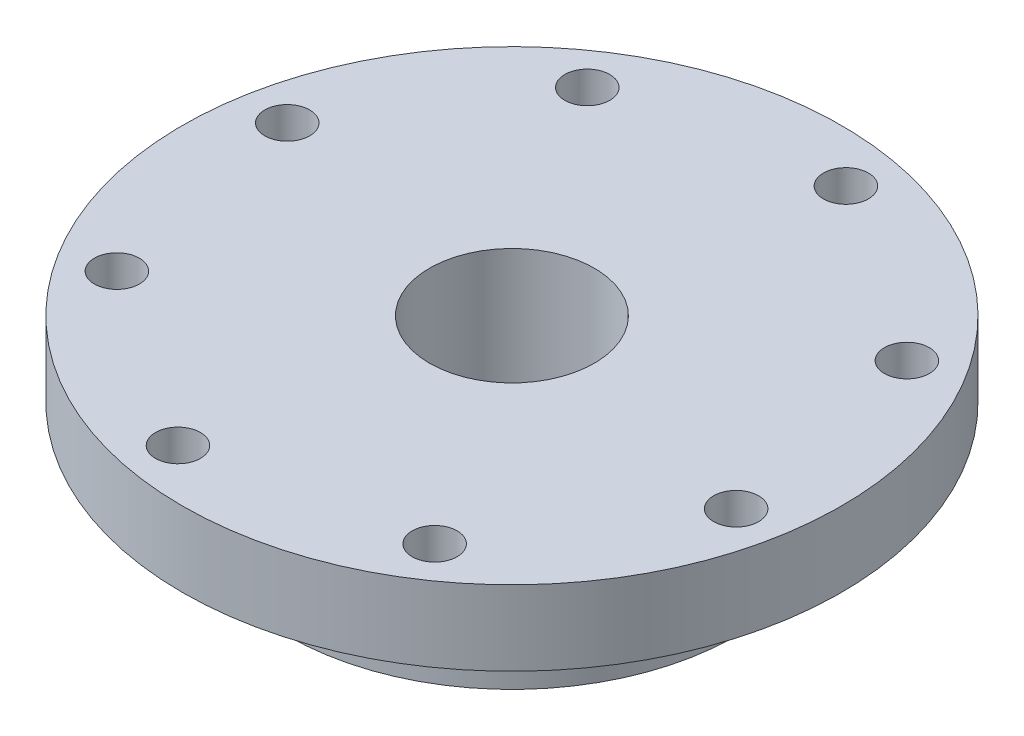
ISO-10303-21;
HEADER;
FILE_DESCRIPTION(('STEP AP214'),'2;1');
FILE_NAME('part.step','',(''),(''),'','','');
FILE_SCHEMA(('AUTOMOTIVE_DESIGN { 1 0 10303 214 1 1 1 1 }'));
ENDSEC;
DATA;
#1=APPLICATION_CONTEXT('core data for automotive mechanical design processes');
#2=APPLICATION_PROTOCOL_DEFINITION('international standard','automotive_design',2000,#1);
#3=PRODUCT_CONTEXT('',#1,'mechanical');
#4=PRODUCT('Part','Part','',(#3));
#5=PRODUCT_RELATED_PRODUCT_CATEGORY('part','',(#4));
#6=PRODUCT_DEFINITION_FORMATION('','',#4);
#7=PRODUCT_DEFINITION_CONTEXT('part definition',#1,'design');
#8=PRODUCT_DEFINITION('design','',#6,#7);
#9=PRODUCT_DEFINITION_SHAPE('','',#8);
#10=(LENGTH_UNIT() NAMED_UNIT(*) SI_UNIT(.MILLI.,.METRE.));
#11=(NAMED_UNIT(*) PLANE_ANGLE_UNIT() SI_UNIT($,.RADIAN.));
#12=(NAMED_UNIT(*) SI_UNIT($,.STERADIAN.) SOLID_ANGLE_UNIT());
#13=UNCERTAINTY_MEASURE_WITH_UNIT(LENGTH_MEASURE(1.E-05),#10,'distance_accuracy_value','');
#14=(GEOMETRIC_REPRESENTATION_CONTEXT(3) GLOBAL_UNCERTAINTY_ASSIGNED_CONTEXT((#13)) GLOBAL_UNIT_ASSIGNED_CONTEXT((#10,
#11,#12)) REPRESENTATION_CONTEXT('',''));
#15=CARTESIAN_POINT('',(0.,0.,0.));
#16=DIRECTION('',(0.,0.,1.));
#17=DIRECTION('',(1.,0.,0.));
#18=AXIS2_PLACEMENT_3D('',#15,#16,#17);
#19=CARTESIAN_POINT('',(0.,41.4701206140351,0.));
#20=DIRECTION('',(0.,1.,0.));
#21=DIRECTION('',(0.,0.,1.));
#22=AXIS2_PLACEMENT_3D('',#19,#20,#21);
#23=CYLINDRICAL_SURFACE('',#22,5.49999999999999);
#24=CARTESIAN_POINT('',(0.,0.,0.));
#25=DIRECTION('',(0.,1.,0.));
#26=DIRECTION('',(0.,0.,1.));
#27=AXIS2_PLACEMENT_3D('',#24,#25,#26);
#28=CIRCLE('',#27,5.49999999999999);
#29=CARTESIAN_POINT('',(0.,0.,5.49999999999999));
#30=VERTEX_POINT('',#29);
#31=EDGE_CURVE('E10',#30,#30,#28,.T.);
#32=ORIENTED_EDGE('',*,*,#31,.T.);
#33=EDGE_LOOP('',(#32));
#34=FACE_BOUND('',#33,.T.);
#35=CARTESIAN_POINT('',(0.,-8.5,0.));
#36=DIRECTION('',(0.,1.,0.));
#37=DIRECTION('',(0.,0.,1.));
#38=AXIS2_PLACEMENT_3D('',#35,#36,#37);
#39=CIRCLE('',#38,5.49999999999999);
#40=CARTESIAN_POINT('',(0.,-8.5,5.49999999999999));
#41=VERTEX_POINT('',#40);
#42=EDGE_CURVE('E96',#41,#41,#39,.T.);
#43=ORIENTED_EDGE('',*,*,#42,.F.);
#44=EDGE_LOOP('',(#43));
#45=FACE_BOUND('',#44,.T.);
#46=ADVANCED_FACE('F32',(#34,#45),#23,.F.);
#47=CARTESIAN_POINT('',(-5.49999999999999,0.,0.));
#48=DIRECTION('',(0.,1.,0.));
#49=DIRECTION('',(0.,0.,1.));
#50=AXIS2_PLACEMENT_3D('',#47,#48,#49);
#51=PLANE('',#50);
#52=CARTESIAN_POINT('',(3.64702438780017,0.,-18.6466944286324));
#53=DIRECTION('',(0.,1.,0.));
#54=DIRECTION('',(0.,0.,1.));
#55=AXIS2_PLACEMENT_3D('',#52,#53,#54);
#56=CIRCLE('',#55,1.49999999999999);
#57=CARTESIAN_POINT('',(3.64702438780017,0.,-17.1466944286324));
#58=VERTEX_POINT('',#57);
#59=EDGE_CURVE('E80',#58,#58,#56,.T.);
#60=ORIENTED_EDGE('',*,*,#59,.F.);
#61=EDGE_LOOP('',(#60));
#62=FACE_BOUND('',#61,.T.);
#63=CARTESIAN_POINT('',(15.7765429582737,0.,-10.5877614388379));
#64=DIRECTION('',(0.,1.,0.));
#65=DIRECTION('',(0.,0.,1.));
#66=AXIS2_PLACEMENT_3D('',#63,#64,#65);
#67=CIRCLE('',#66,1.49999999999999);
#68=CARTESIAN_POINT('',(15.7765429582737,0.,-9.08776143883793));
#69=VERTEX_POINT('',#68);
#70=EDGE_CURVE('E70',#69,#69,#67,.T.);
#71=ORIENTED_EDGE('',*,*,#70,.F.);
#72=EDGE_LOOP('',(#71));
#73=FACE_BOUND('',#72,.T.);
#74=CARTESIAN_POINT('',(18.6413487732147,0.,3.67425038822443));
#75=DIRECTION('',(0.,1.,0.));
#76=DIRECTION('',(0.,0.,1.));
#77=AXIS2_PLACEMENT_3D('',#74,#75,#76);
#78=CIRCLE('',#77,1.49999999999999);
#79=CARTESIAN_POINT('',(18.6413487732147,0.,5.17425038822442));
#80=VERTEX_POINT('',#79);
#81=EDGE_CURVE('E67',#80,#80,#78,.T.);
#82=ORIENTED_EDGE('',*,*,#81,.F.);
#83=EDGE_LOOP('',(#82));
#84=FACE_BOUND('',#83,.T.);
#85=CARTESIAN_POINT('',(-10.6824374733788,0.,-15.7125914357674));
#86=DIRECTION('',(0.,1.,0.));
#87=DIRECTION('',(0.,0.,1.));
#88=AXIS2_PLACEMENT_3D('',#85,#86,#87);
#89=CIRCLE('',#88,1.49999999999999);
#90=CARTESIAN_POINT('',(-10.6824374733788,0.,-14.2125914357675));
#91=VERTEX_POINT('',#90);
#92=EDGE_CURVE('E64',#91,#91,#89,.T.);
#93=ORIENTED_EDGE('',*,*,#92,.F.);
#94=EDGE_LOOP('',(#93));
#95=FACE_BOUND('',#94,.T.);
#96=CARTESIAN_POINT('',(-18.6466944286324,0.,-3.64702438780023));
#97=DIRECTION('',(0.,1.,0.));
#98=DIRECTION('',(0.,0.,1.));
#99=AXIS2_PLACEMENT_3D('',#96,#97,#98);
#100=CIRCLE('',#99,1.49999999999999);
#101=CARTESIAN_POINT('',(-18.6466944286324,0.,-2.14702438780025));
#102=VERTEX_POINT('',#101);
#103=EDGE_CURVE('E60',#102,#102,#100,.T.);
#104=ORIENTED_EDGE('',*,*,#103,.F.);
#105=EDGE_LOOP('',(#104));
#106=FACE_BOUND('',#105,.T.);
#107=CARTESIAN_POINT('',(-15.7640397529656,0.,10.6063684014331));
#108=DIRECTION('',(0.,1.,0.));
#109=DIRECTION('',(0.,0.,1.));
#110=AXIS2_PLACEMENT_3D('',#107,#108,#109);
#111=CIRCLE('',#110,1.49999999999999);
#112=CARTESIAN_POINT('',(-15.7640397529656,0.,12.1063684014331));
#113=VERTEX_POINT('',#112);
#114=EDGE_CURVE('E56',#113,#113,#111,.T.);
#115=ORIENTED_EDGE('',*,*,#114,.F.);
#116=EDGE_LOOP('',(#115));
#117=FACE_BOUND('',#116,.T.);
#118=CARTESIAN_POINT('',(-3.64702438780017,0.,18.6466944286324));
#119=DIRECTION('',(0.,1.,0.));
#120=DIRECTION('',(0.,0.,1.));
#121=AXIS2_PLACEMENT_3D('',#118,#119,#120);
#122=CIRCLE('',#121,1.49999999999999);
#123=CARTESIAN_POINT('',(-3.64702438780017,0.,20.1466944286324));
#124=VERTEX_POINT('',#123);
#125=EDGE_CURVE('E52',#124,#124,#122,.T.);
#126=ORIENTED_EDGE('',*,*,#125,.F.);
#127=EDGE_LOOP('',(#126));
#128=FACE_BOUND('',#127,.T.);
#129=CARTESIAN_POINT('',(10.6063684014331,0.,15.7640397529656));
#130=DIRECTION('',(0.,1.,0.));
#131=DIRECTION('',(0.,0.,1.));
#132=AXIS2_PLACEMENT_3D('',#129,#130,#131);
#133=CIRCLE('',#132,1.49999999999999);
#134=CARTESIAN_POINT('',(10.6063684014331,0.,17.2640397529656));
#135=VERTEX_POINT('',#134);
#136=EDGE_CURVE('E51',#135,#135,#133,.T.);
#137=ORIENTED_EDGE('',*,*,#136,.F.);
#138=EDGE_LOOP('',(#137));
#139=FACE_BOUND('',#138,.T.);
#140=CARTESIAN_POINT('',(0.,0.,0.));
#141=DIRECTION('',(0.,1.,0.));
#142=DIRECTION('',(0.,0.,1.));
#143=AXIS2_PLACEMENT_3D('',#140,#141,#142);
#144=CIRCLE('',#143,22.);
#145=CARTESIAN_POINT('',(0.,0.,22.));
#146=VERTEX_POINT('',#145);
#147=EDGE_CURVE('E39',#146,#146,#144,.T.);
#148=ORIENTED_EDGE('',*,*,#147,.T.);
#149=EDGE_LOOP('',(#148));
#150=FACE_BOUND('',#149,.T.);
#151=ORIENTED_EDGE('',*,*,#31,.F.);
#152=EDGE_LOOP('',(#151));
#153=FACE_BOUND('',#152,.T.);
#154=ADVANCED_FACE('F128',(#62,#73,#84,#95,#106,#117,#128,#139,#150,#153),#51,.T.);
#155=CARTESIAN_POINT('',(0.,41.4701206140351,0.));
#156=DIRECTION('',(0.,1.,0.));
#157=DIRECTION('',(0.,0.,1.));
#158=AXIS2_PLACEMENT_3D('',#155,#156,#157);
#159=CYLINDRICAL_SURFACE('',#158,22.);
#160=CARTESIAN_POINT('',(0.,-5.,0.));
#161=DIRECTION('',(0.,1.,0.));
#162=DIRECTION('',(0.,0.,1.));
#163=AXIS2_PLACEMENT_3D('',#160,#161,#162);
#164=CIRCLE('',#163,22.);
#165=CARTESIAN_POINT('',(0.,-5.,22.));
#166=VERTEX_POINT('',#165);
#167=EDGE_CURVE('E44',#166,#166,#164,.T.);
#168=ORIENTED_EDGE('',*,*,#167,.T.);
#169=EDGE_LOOP('',(#168));
#170=FACE_BOUND('',#169,.T.);
#171=ORIENTED_EDGE('',*,*,#147,.F.);
#172=EDGE_LOOP('',(#171));
#173=FACE_BOUND('',#172,.T.);
#174=ADVANCED_FACE('F113',(#170,#173),#159,.T.);
#175=CARTESIAN_POINT('',(-15.,-5.,0.));
#176=DIRECTION('',(0.,-1.,0.));
#177=DIRECTION('',(0.,0.,-1.));
#178=AXIS2_PLACEMENT_3D('',#175,#176,#177);
#179=PLANE('',#178);
#180=CARTESIAN_POINT('',(3.64702438780017,-5.,-18.6466944286324));
#181=DIRECTION('',(0.,-1.,0.));
#182=DIRECTION('',(0.,0.,-1.));
#183=AXIS2_PLACEMENT_3D('',#180,#181,#182);
#184=CIRCLE('',#183,1.49999999999999);
#185=CARTESIAN_POINT('',(3.64702438780017,-5.,-20.1466944286324));
#186=VERTEX_POINT('',#185);
#187=EDGE_CURVE('E35',#186,#186,#184,.T.);
#188=ORIENTED_EDGE('',*,*,#187,.F.);
#189=EDGE_LOOP('',(#188));
#190=FACE_BOUND('',#189,.T.);
#191=CARTESIAN_POINT('',(15.7765429582737,-5.,-10.5877614388379));
#192=DIRECTION('',(0.,-1.,0.));
#193=DIRECTION('',(0.,0.,-1.));
#194=AXIS2_PLACEMENT_3D('',#191,#192,#193);
#195=CIRCLE('',#194,1.49999999999999);
#196=CARTESIAN_POINT('',(15.7765429582737,-5.,-12.0877614388379));
#197=VERTEX_POINT('',#196);
#198=EDGE_CURVE('E68',#197,#197,#195,.T.);
#199=ORIENTED_EDGE('',*,*,#198,.F.);
#200=EDGE_LOOP('',(#199));
#201=FACE_BOUND('',#200,.T.);
#202=CARTESIAN_POINT('',(18.6413487732147,-5.,3.67425038822443));
#203=DIRECTION('',(0.,-1.,0.));
#204=DIRECTION('',(0.,0.,-1.));
#205=AXIS2_PLACEMENT_3D('',#202,#203,#204);
#206=CIRCLE('',#205,1.49999999999999);
#207=CARTESIAN_POINT('',(18.6413487732147,-5.,2.17425038822444));
#208=VERTEX_POINT('',#207);
#209=EDGE_CURVE('E65',#208,#208,#206,.T.);
#210=ORIENTED_EDGE('',*,*,#209,.F.);
#211=EDGE_LOOP('',(#210));
#212=FACE_BOUND('',#211,.T.);
#213=CARTESIAN_POINT('',(-10.6824374733788,-5.,-15.7125914357674));
#214=DIRECTION('',(0.,-1.,0.));
#215=DIRECTION('',(0.,0.,-1.));
#216=AXIS2_PLACEMENT_3D('',#213,#214,#215);
#217=CIRCLE('',#216,1.49999999999999);
#218=CARTESIAN_POINT('',(-10.6824374733788,-5.,-17.2125914357674));
#219=VERTEX_POINT('',#218);
#220=EDGE_CURVE('E61',#219,#219,#217,.T.);
#221=ORIENTED_EDGE('',*,*,#220,.F.);
#222=EDGE_LOOP('',(#221));
#223=FACE_BOUND('',#222,.T.);
#224=CARTESIAN_POINT('',(-18.6466944286324,-5.,-3.64702438780023));
#225=DIRECTION('',(0.,-1.,0.));
#226=DIRECTION('',(0.,0.,-1.));
#227=AXIS2_PLACEMENT_3D('',#224,#225,#226);
#228=CIRCLE('',#227,1.49999999999999);
#229=CARTESIAN_POINT('',(-18.6466944286324,-5.,-5.14702438780023));
#230=VERTEX_POINT('',#229);
#231=EDGE_CURVE('E57',#230,#230,#228,.T.);
#232=ORIENTED_EDGE('',*,*,#231,.F.);
#233=EDGE_LOOP('',(#232));
#234=FACE_BOUND('',#233,.T.);
#235=CARTESIAN_POINT('',(-15.7640397529656,-5.,10.6063684014331));
#236=DIRECTION('',(0.,-1.,0.));
#237=DIRECTION('',(0.,0.,-1.));
#238=AXIS2_PLACEMENT_3D('',#235,#236,#237);
#239=CIRCLE('',#238,1.49999999999999);
#240=CARTESIAN_POINT('',(-15.7640397529656,-5.,9.10636840143314));
#241=VERTEX_POINT('',#240);
#242=EDGE_CURVE('E53',#241,#241,#239,.T.);
#243=ORIENTED_EDGE('',*,*,#242,.F.);
#244=EDGE_LOOP('',(#243));
#245=FACE_BOUND('',#244,.T.);
#246=CARTESIAN_POINT('',(-3.64702438780017,-5.,18.6466944286324));
#247=DIRECTION('',(0.,-1.,0.));
#248=DIRECTION('',(0.,0.,-1.));
#249=AXIS2_PLACEMENT_3D('',#246,#247,#248);
#250=CIRCLE('',#249,1.49999999999999);
#251=CARTESIAN_POINT('',(-3.64702438780017,-5.,17.1466944286324));
#252=VERTEX_POINT('',#251);
#253=EDGE_CURVE('E48',#252,#252,#250,.T.);
#254=ORIENTED_EDGE('',*,*,#253,.F.);
#255=EDGE_LOOP('',(#254));
#256=FACE_BOUND('',#255,.T.);
#257=CARTESIAN_POINT('',(10.6063684014331,-5.,15.7640397529656));
#258=DIRECTION('',(0.,-1.,0.));
#259=DIRECTION('',(0.,0.,-1.));
#260=AXIS2_PLACEMENT_3D('',#257,#258,#259);
#261=CIRCLE('',#260,1.49999999999999);
#262=CARTESIAN_POINT('',(10.6063684014331,-5.,14.2640397529656));
#263=VERTEX_POINT('',#262);
#264=EDGE_CURVE('E93',#263,#263,#261,.T.);
#265=ORIENTED_EDGE('',*,*,#264,.F.);
#266=EDGE_LOOP('',(#265));
#267=FACE_BOUND('',#266,.T.);
#268=CARTESIAN_POINT('',(0.,-5.,0.));
#269=DIRECTION('',(0.,1.,0.));
#270=DIRECTION('',(0.,0.,1.));
#271=AXIS2_PLACEMENT_3D('',#268,#269,#270);
#272=CIRCLE('',#271,15.);
#273=CARTESIAN_POINT('',(0.,-5.,15.));
#274=VERTEX_POINT('',#273);
#275=EDGE_CURVE('E108',#274,#274,#272,.T.);
#276=ORIENTED_EDGE('',*,*,#275,.T.);
#277=EDGE_LOOP('',(#276));
#278=FACE_BOUND('',#277,.T.);
#279=ORIENTED_EDGE('',*,*,#167,.F.);
#280=EDGE_LOOP('',(#279));
#281=FACE_BOUND('',#280,.T.);
#282=ADVANCED_FACE('F116',(#190,#201,#212,#223,#234,#245,#256,#267,#278,#281),#179,.T.);
#283=CARTESIAN_POINT('',(0.,41.4701206140351,0.));
#284=DIRECTION('',(0.,1.,0.));
#285=DIRECTION('',(0.,0.,1.));
#286=AXIS2_PLACEMENT_3D('',#283,#284,#285);
#287=CYLINDRICAL_SURFACE('',#286,15.);
#288=CARTESIAN_POINT('',(0.,-11.,0.));
#289=DIRECTION('',(0.,1.,0.));
#290=DIRECTION('',(0.,0.,1.));
#291=AXIS2_PLACEMENT_3D('',#288,#289,#290);
#292=CIRCLE('',#291,15.);
#293=CARTESIAN_POINT('',(0.,-11.,15.));
#294=VERTEX_POINT('',#293);
#295=EDGE_CURVE('E105',#294,#294,#292,.T.);
#296=ORIENTED_EDGE('',*,*,#295,.T.);
#297=EDGE_LOOP('',(#296));
#298=FACE_BOUND('',#297,.T.);
#299=ORIENTED_EDGE('',*,*,#275,.F.);
#300=EDGE_LOOP('',(#299));
#301=FACE_BOUND('',#300,.T.);
#302=ADVANCED_FACE('F118',(#298,#301),#287,.T.);
#303=CARTESIAN_POINT('',(-15.,-11.,0.));
#304=DIRECTION('',(0.,-1.,0.));
#305=DIRECTION('',(0.,0.,-1.));
#306=AXIS2_PLACEMENT_3D('',#303,#304,#305);
#307=PLANE('',#306);
#308=CARTESIAN_POINT('',(0.,-11.,0.));
#309=DIRECTION('',(0.,1.,0.));
#310=DIRECTION('',(0.,0.,1.));
#311=AXIS2_PLACEMENT_3D('',#308,#309,#310);
#312=CIRCLE('',#311,11.);
#313=CARTESIAN_POINT('',(0.,-11.,11.));
#314=VERTEX_POINT('',#313);
#315=EDGE_CURVE('E102',#314,#314,#312,.T.);
#316=ORIENTED_EDGE('',*,*,#315,.T.);
#317=EDGE_LOOP('',(#316));
#318=FACE_BOUND('',#317,.T.);
#319=ORIENTED_EDGE('',*,*,#295,.F.);
#320=EDGE_LOOP('',(#319));
#321=FACE_BOUND('',#320,.T.);
#322=ADVANCED_FACE('F125',(#318,#321),#307,.T.);
#323=CARTESIAN_POINT('',(0.,41.4701206140351,0.));
#324=DIRECTION('',(0.,1.,0.));
#325=DIRECTION('',(0.,0.,1.));
#326=AXIS2_PLACEMENT_3D('',#323,#324,#325);
#327=CYLINDRICAL_SURFACE('',#326,11.);
#328=CARTESIAN_POINT('',(0.,-8.5,0.));
#329=DIRECTION('',(0.,1.,0.));
#330=DIRECTION('',(0.,0.,1.));
#331=AXIS2_PLACEMENT_3D('',#328,#329,#330);
#332=CIRCLE('',#331,11.);
#333=CARTESIAN_POINT('',(0.,-8.5,11.));
#334=VERTEX_POINT('',#333);
#335=EDGE_CURVE('E99',#334,#334,#332,.T.);
#336=ORIENTED_EDGE('',*,*,#335,.T.);
#337=EDGE_LOOP('',(#336));
#338=FACE_BOUND('',#337,.T.);
#339=ORIENTED_EDGE('',*,*,#315,.F.);
#340=EDGE_LOOP('',(#339));
#341=FACE_BOUND('',#340,.T.);
#342=ADVANCED_FACE('F144',(#338,#341),#327,.F.);
#343=CARTESIAN_POINT('',(-11.,-8.5,0.));
#344=DIRECTION('',(0.,-1.,0.));
#345=DIRECTION('',(0.,0.,-1.));
#346=AXIS2_PLACEMENT_3D('',#343,#344,#345);
#347=PLANE('',#346);
#348=ORIENTED_EDGE('',*,*,#42,.T.);
#349=EDGE_LOOP('',(#348));
#350=FACE_BOUND('',#349,.T.);
#351=ORIENTED_EDGE('',*,*,#335,.F.);
#352=EDGE_LOOP('',(#351));
#353=FACE_BOUND('',#352,.T.);
#354=ADVANCED_FACE('F140',(#350,#353),#347,.T.);
#355=CARTESIAN_POINT('',(10.6063684014331,0.,15.7640397529656));
#356=DIRECTION('',(0.,1.,0.));
#357=DIRECTION('',(0.,0.,1.));
#358=AXIS2_PLACEMENT_3D('',#355,#356,#357);
#359=CYLINDRICAL_SURFACE('',#358,1.49999999999999);
#360=ORIENTED_EDGE('',*,*,#264,.T.);
#361=EDGE_LOOP('',(#360));
#362=FACE_BOUND('',#361,.T.);
#363=ORIENTED_EDGE('',*,*,#136,.T.);
#364=EDGE_LOOP('',(#363));
#365=FACE_BOUND('',#364,.T.);
#366=ADVANCED_FACE('F143',(#362,#365),#359,.F.);
#367=CARTESIAN_POINT('',(-3.64702438780017,0.,18.6466944286324));
#368=DIRECTION('',(0.,1.,0.));
#369=DIRECTION('',(0.,0.,1.));
#370=AXIS2_PLACEMENT_3D('',#367,#368,#369);
#371=CYLINDRICAL_SURFACE('',#370,1.49999999999999);
#372=ORIENTED_EDGE('',*,*,#253,.T.);
#373=EDGE_LOOP('',(#372));
#374=FACE_BOUND('',#373,.T.);
#375=ORIENTED_EDGE('',*,*,#125,.T.);
#376=EDGE_LOOP('',(#375));
#377=FACE_BOUND('',#376,.T.);
#378=ADVANCED_FACE('F165',(#374,#377),#371,.F.);
#379=CARTESIAN_POINT('',(-15.7640397529656,0.,10.6063684014331));
#380=DIRECTION('',(0.,1.,0.));
#381=DIRECTION('',(0.,0.,1.));
#382=AXIS2_PLACEMENT_3D('',#379,#380,#381);
#383=CYLINDRICAL_SURFACE('',#382,1.49999999999999);
#384=ORIENTED_EDGE('',*,*,#242,.T.);
#385=EDGE_LOOP('',(#384));
#386=FACE_BOUND('',#385,.T.);
#387=ORIENTED_EDGE('',*,*,#114,.T.);
#388=EDGE_LOOP('',(#387));
#389=FACE_BOUND('',#388,.T.);
#390=ADVANCED_FACE('F169',(#386,#389),#383,.F.);
#391=CARTESIAN_POINT('',(-18.6466944286324,0.,-3.64702438780023));
#392=DIRECTION('',(0.,1.,0.));
#393=DIRECTION('',(0.,0.,1.));
#394=AXIS2_PLACEMENT_3D('',#391,#392,#393);
#395=CYLINDRICAL_SURFACE('',#394,1.49999999999999);
#396=ORIENTED_EDGE('',*,*,#231,.T.);
#397=EDGE_LOOP('',(#396));
#398=FACE_BOUND('',#397,.T.);
#399=ORIENTED_EDGE('',*,*,#103,.T.);
#400=EDGE_LOOP('',(#399));
#401=FACE_BOUND('',#400,.T.);
#402=ADVANCED_FACE('F173',(#398,#401),#395,.F.);
#403=CARTESIAN_POINT('',(-10.6824374733788,0.,-15.7125914357674));
#404=DIRECTION('',(0.,1.,0.));
#405=DIRECTION('',(0.,0.,1.));
#406=AXIS2_PLACEMENT_3D('',#403,#404,#405);
#407=CYLINDRICAL_SURFACE('',#406,1.49999999999999);
#408=ORIENTED_EDGE('',*,*,#220,.T.);
#409=EDGE_LOOP('',(#408));
#410=FACE_BOUND('',#409,.T.);
#411=ORIENTED_EDGE('',*,*,#92,.T.);
#412=EDGE_LOOP('',(#411));
#413=FACE_BOUND('',#412,.T.);
#414=ADVANCED_FACE('F177',(#410,#413),#407,.F.);
#415=CARTESIAN_POINT('',(18.6413487732147,0.,3.67425038822443));
#416=DIRECTION('',(0.,1.,0.));
#417=DIRECTION('',(0.,0.,1.));
#418=AXIS2_PLACEMENT_3D('',#415,#416,#417);
#419=CYLINDRICAL_SURFACE('',#418,1.49999999999999);
#420=ORIENTED_EDGE('',*,*,#209,.T.);
#421=EDGE_LOOP('',(#420));
#422=FACE_BOUND('',#421,.T.);
#423=ORIENTED_EDGE('',*,*,#81,.T.);
#424=EDGE_LOOP('',(#423));
#425=FACE_BOUND('',#424,.T.);
#426=ADVANCED_FACE('F181',(#422,#425),#419,.F.);
#427=CARTESIAN_POINT('',(15.7765429582737,0.,-10.5877614388379));
#428=DIRECTION('',(0.,1.,0.));
#429=DIRECTION('',(0.,0.,1.));
#430=AXIS2_PLACEMENT_3D('',#427,#428,#429);
#431=CYLINDRICAL_SURFACE('',#430,1.49999999999999);
#432=ORIENTED_EDGE('',*,*,#198,.T.);
#433=EDGE_LOOP('',(#432));
#434=FACE_BOUND('',#433,.T.);
#435=ORIENTED_EDGE('',*,*,#70,.T.);
#436=EDGE_LOOP('',(#435));
#437=FACE_BOUND('',#436,.T.);
#438=ADVANCED_FACE('F185',(#434,#437),#431,.F.);
#439=CARTESIAN_POINT('',(3.64702438780017,0.,-18.6466944286324));
#440=DIRECTION('',(0.,1.,0.));
#441=DIRECTION('',(0.,0.,1.));
#442=AXIS2_PLACEMENT_3D('',#439,#440,#441);
#443=CYLINDRICAL_SURFACE('',#442,1.49999999999999);
#444=ORIENTED_EDGE('',*,*,#187,.T.);
#445=EDGE_LOOP('',(#444));
#446=FACE_BOUND('',#445,.T.);
#447=ORIENTED_EDGE('',*,*,#59,.T.);
#448=EDGE_LOOP('',(#447));
#449=FACE_BOUND('',#448,.T.);
#450=ADVANCED_FACE('F189',(#446,#449),#443,.F.);
#451=CLOSED_SHELL('',(#46,#154,#174,#282,#302,#322,#342,#354,#366,#378,#390,#402,#414,#426,#438,#450));
#452=MANIFOLD_SOLID_BREP('B2',#451);
#453=ADVANCED_BREP_SHAPE_REPRESENTATION('',(#18,#452),#14);
#454=SHAPE_DEFINITION_REPRESENTATION(#9,#453);
ENDSEC;
END-ISO-10303-21;
